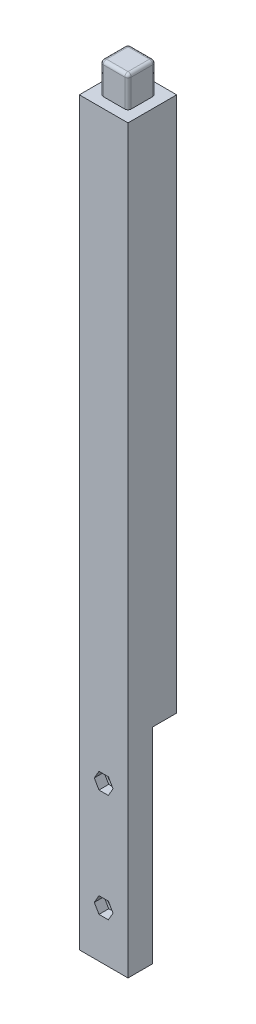
ISO-10303-21;
HEADER;
FILE_DESCRIPTION(('STEP AP214'),'2;1');
FILE_NAME('part.step','',(''),(''),'','','');
FILE_SCHEMA(('AUTOMOTIVE_DESIGN { 1 0 10303 214 1 1 1 1 }'));
ENDSEC;
DATA;
#1=APPLICATION_CONTEXT('core data for automotive mechanical design processes');
#2=APPLICATION_PROTOCOL_DEFINITION('international standard','automotive_design',2000,#1);
#3=PRODUCT_CONTEXT('',#1,'mechanical');
#4=PRODUCT('Part','Part','',(#3));
#5=PRODUCT_RELATED_PRODUCT_CATEGORY('part','',(#4));
#6=PRODUCT_DEFINITION_FORMATION('','',#4);
#7=PRODUCT_DEFINITION_CONTEXT('part definition',#1,'design');
#8=PRODUCT_DEFINITION('design','',#6,#7);
#9=PRODUCT_DEFINITION_SHAPE('','',#8);
#10=(LENGTH_UNIT() NAMED_UNIT(*) SI_UNIT(.MILLI.,.METRE.));
#11=(NAMED_UNIT(*) PLANE_ANGLE_UNIT() SI_UNIT($,.RADIAN.));
#12=(NAMED_UNIT(*) SI_UNIT($,.STERADIAN.) SOLID_ANGLE_UNIT());
#13=UNCERTAINTY_MEASURE_WITH_UNIT(LENGTH_MEASURE(1.E-05),#10,'distance_accuracy_value','');
#14=(GEOMETRIC_REPRESENTATION_CONTEXT(3) GLOBAL_UNCERTAINTY_ASSIGNED_CONTEXT((#13)) GLOBAL_UNIT_ASSIGNED_CONTEXT((#10,
#11,#12)) REPRESENTATION_CONTEXT('',''));
#15=CARTESIAN_POINT('',(0.,0.,0.));
#16=DIRECTION('',(0.,0.,1.));
#17=DIRECTION('',(1.,0.,0.));
#18=AXIS2_PLACEMENT_3D('',#15,#16,#17);
#19=CARTESIAN_POINT('',(352.5,-128.191488077077,42.3497474683057));
#20=DIRECTION('',(0.,0.,-1.));
#21=DIRECTION('',(-1.,0.,0.));
#22=AXIS2_PLACEMENT_3D('',#19,#20,#21);
#23=CYLINDRICAL_SURFACE('',#22,1.74999999999998);
#24=CARTESIAN_POINT('',(352.5,-128.191488077077,-99.9));
#25=DIRECTION('',(0.,0.,-1.));
#26=DIRECTION('',(-1.,0.,0.));
#27=AXIS2_PLACEMENT_3D('',#24,#25,#26);
#28=CIRCLE('',#27,1.74999999999998);
#29=CARTESIAN_POINT('',(350.75,-128.191488077077,-99.9));
#30=VERTEX_POINT('',#29);
#31=EDGE_CURVE('E363',#30,#30,#28,.T.);
#32=ORIENTED_EDGE('',*,*,#31,.T.);
#33=EDGE_LOOP('',(#32));
#34=FACE_BOUND('',#33,.T.);
#35=CARTESIAN_POINT('',(352.5,-128.191488077077,-95.4));
#36=DIRECTION('',(0.,0.,1.));
#37=DIRECTION('',(1.,0.,0.));
#38=AXIS2_PLACEMENT_3D('',#35,#36,#37);
#39=CIRCLE('',#38,1.74999999999998);
#40=CARTESIAN_POINT('',(354.25,-128.191488077077,-95.4));
#41=VERTEX_POINT('',#40);
#42=EDGE_CURVE('E41',#41,#41,#39,.F.);
#43=ORIENTED_EDGE('',*,*,#42,.F.);
#44=EDGE_LOOP('',(#43));
#45=FACE_BOUND('',#44,.T.);
#46=ADVANCED_FACE('F37',(#34,#45),#23,.F.);
#47=CARTESIAN_POINT('',(352.5,-95.0000000000001,42.3497474683057));
#48=DIRECTION('',(0.,0.,-1.));
#49=DIRECTION('',(-1.,0.,0.));
#50=AXIS2_PLACEMENT_3D('',#47,#48,#49);
#51=CYLINDRICAL_SURFACE('',#50,1.74999999999998);
#52=CARTESIAN_POINT('',(352.5,-95.0000000000001,-99.9));
#53=DIRECTION('',(0.,0.,-1.));
#54=DIRECTION('',(-1.,0.,0.));
#55=AXIS2_PLACEMENT_3D('',#52,#53,#54);
#56=CIRCLE('',#55,1.74999999999998);
#57=CARTESIAN_POINT('',(350.75,-95.0000000000001,-99.9));
#58=VERTEX_POINT('',#57);
#59=EDGE_CURVE('E367',#58,#58,#56,.T.);
#60=ORIENTED_EDGE('',*,*,#59,.T.);
#61=EDGE_LOOP('',(#60));
#62=FACE_BOUND('',#61,.T.);
#63=CARTESIAN_POINT('',(352.5,-95.0000000000001,-95.4));
#64=DIRECTION('',(0.,0.,1.));
#65=DIRECTION('',(1.,0.,0.));
#66=AXIS2_PLACEMENT_3D('',#63,#64,#65);
#67=CIRCLE('',#66,1.74999999999998);
#68=CARTESIAN_POINT('',(354.25,-95.0000000000001,-95.4));
#69=VERTEX_POINT('',#68);
#70=EDGE_CURVE('E288',#69,#69,#67,.F.);
#71=ORIENTED_EDGE('',*,*,#70,.F.);
#72=EDGE_LOOP('',(#71));
#73=FACE_BOUND('',#72,.T.);
#74=ADVANCED_FACE('F566',(#62,#73),#51,.F.);
#75=CARTESIAN_POINT('',(360.01,-143.191488077077,-99.9));
#76=DIRECTION('',(0.,-1.,0.));
#77=DIRECTION('',(0.,0.,-1.));
#78=AXIS2_PLACEMENT_3D('',#75,#76,#77);
#79=PLANE('',#78);
#80=DIRECTION('',(0.,0.,-1.));
#81=VECTOR('',#80,1.);
#82=CARTESIAN_POINT('',(360.,-143.191488077077,-107.4));
#83=LINE('',#82,#81);
#84=CARTESIAN_POINT('',(360.,-143.191488077077,-92.4));
#85=VERTEX_POINT('',#84);
#86=CARTESIAN_POINT('',(360.,-143.191488077077,-99.9));
#87=VERTEX_POINT('',#86);
#88=EDGE_CURVE('E531',#85,#87,#83,.T.);
#89=ORIENTED_EDGE('',*,*,#88,.F.);
#90=DIRECTION('',(1.,0.,0.));
#91=VECTOR('',#90,1.);
#92=CARTESIAN_POINT('',(345.,-143.191488077077,-92.4));
#93=LINE('',#92,#91);
#94=CARTESIAN_POINT('',(345.,-143.191488077077,-92.4));
#95=VERTEX_POINT('',#94);
#96=EDGE_CURVE('E371',#95,#85,#93,.T.);
#97=ORIENTED_EDGE('',*,*,#96,.F.);
#98=DIRECTION('',(0.,0.,1.));
#99=VECTOR('',#98,1.);
#100=CARTESIAN_POINT('',(345.,-143.191488077077,-107.4));
#101=LINE('',#100,#99);
#102=CARTESIAN_POINT('',(345.,-143.191488077077,-99.9));
#103=VERTEX_POINT('',#102);
#104=EDGE_CURVE('E407',#103,#95,#101,.T.);
#105=ORIENTED_EDGE('',*,*,#104,.F.);
#106=DIRECTION('',(-1.,0.,0.));
#107=VECTOR('',#106,1.);
#108=CARTESIAN_POINT('',(360.01,-143.191488077077,-99.9));
#109=LINE('',#108,#107);
#110=EDGE_CURVE('E11',#87,#103,#109,.T.);
#111=ORIENTED_EDGE('',*,*,#110,.F.);
#112=EDGE_LOOP('',(#89,#97,#105,#111));
#113=FACE_BOUND('',#112,.T.);
#114=ADVANCED_FACE('F572',(#113),#79,.T.);
#115=CARTESIAN_POINT('',(360.01,-80.,-99.9));
#116=DIRECTION('',(0.,0.,-1.));
#117=DIRECTION('',(-1.,0.,0.));
#118=AXIS2_PLACEMENT_3D('',#115,#116,#117);
#119=PLANE('',#118);
#120=ORIENTED_EDGE('',*,*,#59,.F.);
#121=EDGE_LOOP('',(#120));
#122=FACE_BOUND('',#121,.T.);
#123=ORIENTED_EDGE('',*,*,#31,.F.);
#124=EDGE_LOOP('',(#123));
#125=FACE_BOUND('',#124,.T.);
#126=DIRECTION('',(0.,1.,0.));
#127=VECTOR('',#126,1.);
#128=CARTESIAN_POINT('',(360.,-349.404691512674,-99.9));
#129=LINE('',#128,#127);
#130=CARTESIAN_POINT('',(360.,-80.,-99.9));
#131=VERTEX_POINT('',#130);
#132=EDGE_CURVE('E535',#87,#131,#129,.T.);
#133=ORIENTED_EDGE('',*,*,#132,.F.);
#134=ORIENTED_EDGE('',*,*,#110,.T.);
#135=DIRECTION('',(0.,-1.,0.));
#136=VECTOR('',#135,1.);
#137=CARTESIAN_POINT('',(345.,-349.404691512674,-99.9));
#138=LINE('',#137,#136);
#139=CARTESIAN_POINT('',(345.,-80.,-99.9));
#140=VERTEX_POINT('',#139);
#141=EDGE_CURVE('E519',#140,#103,#138,.T.);
#142=ORIENTED_EDGE('',*,*,#141,.F.);
#143=DIRECTION('',(-1.,0.,0.));
#144=VECTOR('',#143,1.);
#145=CARTESIAN_POINT('',(360.01,-80.,-99.9));
#146=LINE('',#145,#144);
#147=EDGE_CURVE('E47',#131,#140,#146,.T.);
#148=ORIENTED_EDGE('',*,*,#147,.F.);
#149=EDGE_LOOP('',(#133,#134,#142,#148));
#150=FACE_BOUND('',#149,.T.);
#151=ADVANCED_FACE('F652',(#122,#125,#150),#119,.T.);
#152=CARTESIAN_POINT('',(360.01,-80.,-107.4));
#153=DIRECTION('',(0.,-1.,0.));
#154=DIRECTION('',(0.,0.,-1.));
#155=AXIS2_PLACEMENT_3D('',#152,#153,#154);
#156=PLANE('',#155);
#157=DIRECTION('',(0.,0.,-1.));
#158=VECTOR('',#157,1.);
#159=CARTESIAN_POINT('',(360.,-80.,-107.4));
#160=LINE('',#159,#158);
#161=CARTESIAN_POINT('',(360.,-80.0000000000001,-107.4));
#162=VERTEX_POINT('',#161);
#163=EDGE_CURVE('E539',#131,#162,#160,.T.);
#164=ORIENTED_EDGE('',*,*,#163,.F.);
#165=ORIENTED_EDGE('',*,*,#147,.T.);
#166=DIRECTION('',(0.,0.,1.));
#167=VECTOR('',#166,1.);
#168=CARTESIAN_POINT('',(345.,-80.,-107.4));
#169=LINE('',#168,#167);
#170=CARTESIAN_POINT('',(345.,-80.0000000000001,-107.4));
#171=VERTEX_POINT('',#170);
#172=EDGE_CURVE('E523',#171,#140,#169,.T.);
#173=ORIENTED_EDGE('',*,*,#172,.F.);
#174=DIRECTION('',(-1.,0.,0.));
#175=VECTOR('',#174,1.);
#176=CARTESIAN_POINT('',(345.,-80.,-107.4));
#177=LINE('',#176,#175);
#178=EDGE_CURVE('E527',#162,#171,#177,.T.);
#179=ORIENTED_EDGE('',*,*,#178,.F.);
#180=EDGE_LOOP('',(#164,#165,#173,#179));
#181=FACE_BOUND('',#180,.T.);
#182=ADVANCED_FACE('F650',(#181),#156,.T.);
#183=CARTESIAN_POINT('',(349.2,94.5,-96.6));
#184=DIRECTION('',(0.,-1.,0.));
#185=DIRECTION('',(0.,0.,-1.));
#186=AXIS2_PLACEMENT_3D('',#183,#184,#185);
#187=PLANE('',#186);
#188=DIRECTION('',(-1.,0.,0.));
#189=VECTOR('',#188,1.);
#190=CARTESIAN_POINT('',(349.2,94.5,-103.2));
#191=LINE('',#190,#189);
#192=CARTESIAN_POINT('',(355.8,94.5,-103.2));
#193=VERTEX_POINT('',#192);
#194=CARTESIAN_POINT('',(349.2,94.5,-103.2));
#195=VERTEX_POINT('',#194);
#196=EDGE_CURVE('E429',#193,#195,#191,.T.);
#197=ORIENTED_EDGE('',*,*,#196,.T.);
#198=DIRECTION('',(0.,0.,1.));
#199=VECTOR('',#198,1.);
#200=CARTESIAN_POINT('',(349.2,94.5,-96.6));
#201=LINE('',#200,#199);
#202=CARTESIAN_POINT('',(349.2,94.5,-96.6));
#203=VERTEX_POINT('',#202);
#204=EDGE_CURVE('E425',#195,#203,#201,.T.);
#205=ORIENTED_EDGE('',*,*,#204,.T.);
#206=DIRECTION('',(1.,0.,0.));
#207=VECTOR('',#206,1.);
#208=CARTESIAN_POINT('',(349.2,94.5,-96.6));
#209=LINE('',#208,#207);
#210=CARTESIAN_POINT('',(355.8,94.5,-96.6));
#211=VERTEX_POINT('',#210);
#212=EDGE_CURVE('E435',#203,#211,#209,.T.);
#213=ORIENTED_EDGE('',*,*,#212,.T.);
#214=DIRECTION('',(0.,0.,-1.));
#215=VECTOR('',#214,1.);
#216=CARTESIAN_POINT('',(355.8,94.5,-96.6));
#217=LINE('',#216,#215);
#218=EDGE_CURVE('E432',#211,#193,#217,.T.);
#219=ORIENTED_EDGE('',*,*,#218,.T.);
#220=EDGE_LOOP('',(#197,#205,#213,#219));
#221=FACE_BOUND('',#220,.T.);
#222=ADVANCED_FACE('F575',(#221),#187,.F.);
#223=CARTESIAN_POINT('',(349.2,93.5,-96.6));
#224=DIRECTION('',(1.,0.,0.));
#225=DIRECTION('',(0.,0.,-1.));
#226=AXIS2_PLACEMENT_3D('',#223,#224,#225);
#227=CYLINDRICAL_SURFACE('',#226,1.);
#228=CARTESIAN_POINT('',(355.8,93.5,-96.6));
#229=DIRECTION('',(-1.,0.,0.));
#230=DIRECTION('',(0.,0.,1.));
#231=AXIS2_PLACEMENT_3D('',#228,#229,#230);
#232=CIRCLE('',#231,1.);
#233=CARTESIAN_POINT('',(355.8,93.5,-95.6));
#234=VERTEX_POINT('',#233);
#235=EDGE_CURVE('E393',#234,#211,#232,.T.);
#236=ORIENTED_EDGE('',*,*,#235,.T.);
#237=ORIENTED_EDGE('',*,*,#212,.F.);
#238=CARTESIAN_POINT('',(349.2,93.5,-96.6));
#239=DIRECTION('',(-1.,0.,0.));
#240=DIRECTION('',(0.,0.,1.));
#241=AXIS2_PLACEMENT_3D('',#238,#239,#240);
#242=CIRCLE('',#241,1.);
#243=CARTESIAN_POINT('',(349.2,93.5,-95.6));
#244=VERTEX_POINT('',#243);
#245=EDGE_CURVE('E400',#244,#203,#242,.T.);
#246=ORIENTED_EDGE('',*,*,#245,.F.);
#247=DIRECTION('',(1.,0.,0.));
#248=VECTOR('',#247,1.);
#249=CARTESIAN_POINT('',(349.2,93.5,-95.6));
#250=LINE('',#249,#248);
#251=EDGE_CURVE('E403',#234,#244,#250,.F.);
#252=ORIENTED_EDGE('',*,*,#251,.F.);
#253=EDGE_LOOP('',(#236,#237,#246,#252));
#254=FACE_BOUND('',#253,.T.);
#255=ADVANCED_FACE('F598',(#254),#227,.T.);
#256=CARTESIAN_POINT('',(355.8,93.5,-96.6));
#257=DIRECTION('',(0.,-1.,0.));
#258=DIRECTION('',(0.,0.,-1.));
#259=AXIS2_PLACEMENT_3D('',#256,#257,#258);
#260=SPHERICAL_SURFACE('',#259,1.);
#261=CARTESIAN_POINT('',(355.8,93.5,-96.6));
#262=DIRECTION('',(0.,-1.,0.));
#263=DIRECTION('',(0.,0.,-1.));
#264=AXIS2_PLACEMENT_3D('',#261,#262,#263);
#265=CIRCLE('',#264,1.);
#266=CARTESIAN_POINT('',(356.8,93.5,-96.6));
#267=VERTEX_POINT('',#266);
#268=EDGE_CURVE('E406',#267,#234,#265,.T.);
#269=ORIENTED_EDGE('',*,*,#268,.F.);
#270=CARTESIAN_POINT('',(355.8,93.5,-96.6));
#271=DIRECTION('',(0.,0.,1.));
#272=DIRECTION('',(1.,0.,0.));
#273=AXIS2_PLACEMENT_3D('',#270,#271,#272);
#274=CIRCLE('',#273,1.);
#275=EDGE_CURVE('E385',#267,#211,#274,.T.);
#276=ORIENTED_EDGE('',*,*,#275,.T.);
#277=ORIENTED_EDGE('',*,*,#235,.F.);
#278=EDGE_LOOP('',(#269,#276,#277));
#279=FACE_BOUND('',#278,.T.);
#280=ADVANCED_FACE('F590',(#279),#260,.T.);
#281=CARTESIAN_POINT('',(355.8,93.5,-96.6));
#282=DIRECTION('',(0.,0.,-1.));
#283=DIRECTION('',(-1.,0.,0.));
#284=AXIS2_PLACEMENT_3D('',#281,#282,#283);
#285=CYLINDRICAL_SURFACE('',#284,1.);
#286=CARTESIAN_POINT('',(355.8,93.5,-103.2));
#287=DIRECTION('',(0.,0.,1.));
#288=DIRECTION('',(1.,0.,0.));
#289=AXIS2_PLACEMENT_3D('',#286,#287,#288);
#290=CIRCLE('',#289,1.);
#291=CARTESIAN_POINT('',(356.8,93.5,-103.2));
#292=VERTEX_POINT('',#291);
#293=EDGE_CURVE('E376',#292,#193,#290,.T.);
#294=ORIENTED_EDGE('',*,*,#293,.T.);
#295=ORIENTED_EDGE('',*,*,#218,.F.);
#296=ORIENTED_EDGE('',*,*,#275,.F.);
#297=DIRECTION('',(0.,0.,-1.));
#298=VECTOR('',#297,1.);
#299=CARTESIAN_POINT('',(356.8,93.5,-96.6));
#300=LINE('',#299,#298);
#301=EDGE_CURVE('E410',#292,#267,#300,.F.);
#302=ORIENTED_EDGE('',*,*,#301,.F.);
#303=EDGE_LOOP('',(#294,#295,#296,#302));
#304=FACE_BOUND('',#303,.T.);
#305=ADVANCED_FACE('F582',(#304),#285,.T.);
#306=CARTESIAN_POINT('',(355.8,93.5,-103.2));
#307=DIRECTION('',(0.,-1.,0.));
#308=DIRECTION('',(0.,0.,-1.));
#309=AXIS2_PLACEMENT_3D('',#306,#307,#308);
#310=SPHERICAL_SURFACE('',#309,1.);
#311=ORIENTED_EDGE('',*,*,#293,.F.);
#312=CARTESIAN_POINT('',(355.8,93.5,-103.2));
#313=DIRECTION('',(0.,-1.,0.));
#314=DIRECTION('',(0.,0.,-1.));
#315=AXIS2_PLACEMENT_3D('',#312,#313,#314);
#316=CIRCLE('',#315,1.);
#317=CARTESIAN_POINT('',(355.8,93.5,-104.2));
#318=VERTEX_POINT('',#317);
#319=EDGE_CURVE('E413',#318,#292,#316,.T.);
#320=ORIENTED_EDGE('',*,*,#319,.F.);
#321=CARTESIAN_POINT('',(355.8,93.5,-103.2));
#322=DIRECTION('',(-1.,0.,0.));
#323=DIRECTION('',(0.,0.,1.));
#324=AXIS2_PLACEMENT_3D('',#321,#322,#323);
#325=CIRCLE('',#324,1.);
#326=EDGE_CURVE('E372',#193,#318,#325,.T.);
#327=ORIENTED_EDGE('',*,*,#326,.F.);
#328=EDGE_LOOP('',(#311,#320,#327));
#329=FACE_BOUND('',#328,.T.);
#330=ADVANCED_FACE('F578',(#329),#310,.T.);
#331=CARTESIAN_POINT('',(349.2,93.5,-103.2));
#332=DIRECTION('',(-1.,0.,0.));
#333=DIRECTION('',(0.,0.,1.));
#334=AXIS2_PLACEMENT_3D('',#331,#332,#333);
#335=CYLINDRICAL_SURFACE('',#334,1.);
#336=ORIENTED_EDGE('',*,*,#326,.T.);
#337=DIRECTION('',(-1.,0.,0.));
#338=VECTOR('',#337,1.);
#339=CARTESIAN_POINT('',(355.8,93.5,-104.2));
#340=LINE('',#339,#338);
#341=CARTESIAN_POINT('',(349.2,93.5,-104.2));
#342=VERTEX_POINT('',#341);
#343=EDGE_CURVE('E416',#342,#318,#340,.F.);
#344=ORIENTED_EDGE('',*,*,#343,.F.);
#345=CARTESIAN_POINT('',(349.2,93.5,-103.2));
#346=DIRECTION('',(-1.,0.,0.));
#347=DIRECTION('',(0.,0.,1.));
#348=AXIS2_PLACEMENT_3D('',#345,#346,#347);
#349=CIRCLE('',#348,1.);
#350=EDGE_CURVE('E381',#195,#342,#349,.T.);
#351=ORIENTED_EDGE('',*,*,#350,.F.);
#352=ORIENTED_EDGE('',*,*,#196,.F.);
#353=EDGE_LOOP('',(#336,#344,#351,#352));
#354=FACE_BOUND('',#353,.T.);
#355=ADVANCED_FACE('F581',(#354),#335,.T.);
#356=CARTESIAN_POINT('',(349.2,93.5,-103.2));
#357=DIRECTION('',(0.,-1.,0.));
#358=DIRECTION('',(0.,0.,-1.));
#359=AXIS2_PLACEMENT_3D('',#356,#357,#358);
#360=SPHERICAL_SURFACE('',#359,1.);
#361=ORIENTED_EDGE('',*,*,#350,.T.);
#362=CARTESIAN_POINT('',(349.2,93.5,-103.2));
#363=DIRECTION('',(0.,-1.,0.));
#364=DIRECTION('',(0.,0.,-1.));
#365=AXIS2_PLACEMENT_3D('',#362,#363,#364);
#366=CIRCLE('',#365,1.);
#367=CARTESIAN_POINT('',(348.2,93.5,-103.2));
#368=VERTEX_POINT('',#367);
#369=EDGE_CURVE('E419',#368,#342,#366,.T.);
#370=ORIENTED_EDGE('',*,*,#369,.F.);
#371=CARTESIAN_POINT('',(349.2,93.5,-103.2));
#372=DIRECTION('',(0.,0.,1.));
#373=DIRECTION('',(1.,0.,0.));
#374=AXIS2_PLACEMENT_3D('',#371,#372,#373);
#375=CIRCLE('',#374,1.);
#376=EDGE_CURVE('E389',#195,#368,#375,.T.);
#377=ORIENTED_EDGE('',*,*,#376,.F.);
#378=EDGE_LOOP('',(#361,#370,#377));
#379=FACE_BOUND('',#378,.T.);
#380=ADVANCED_FACE('F586',(#379),#360,.T.);
#381=CARTESIAN_POINT('',(349.2,93.5,-96.6));
#382=DIRECTION('',(0.,0.,1.));
#383=DIRECTION('',(1.,0.,0.));
#384=AXIS2_PLACEMENT_3D('',#381,#382,#383);
#385=CYLINDRICAL_SURFACE('',#384,1.);
#386=ORIENTED_EDGE('',*,*,#376,.T.);
#387=DIRECTION('',(0.,0.,1.));
#388=VECTOR('',#387,1.);
#389=CARTESIAN_POINT('',(348.2,93.5,-103.2));
#390=LINE('',#389,#388);
#391=CARTESIAN_POINT('',(348.2,93.5,-96.6));
#392=VERTEX_POINT('',#391);
#393=EDGE_CURVE('E422',#392,#368,#390,.F.);
#394=ORIENTED_EDGE('',*,*,#393,.F.);
#395=CARTESIAN_POINT('',(349.2,93.5,-96.6));
#396=DIRECTION('',(0.,0.,1.));
#397=DIRECTION('',(1.,0.,0.));
#398=AXIS2_PLACEMENT_3D('',#395,#396,#397);
#399=CIRCLE('',#398,1.);
#400=EDGE_CURVE('E397',#203,#392,#399,.T.);
#401=ORIENTED_EDGE('',*,*,#400,.F.);
#402=ORIENTED_EDGE('',*,*,#204,.F.);
#403=EDGE_LOOP('',(#386,#394,#401,#402));
#404=FACE_BOUND('',#403,.T.);
#405=ADVANCED_FACE('F594',(#404),#385,.T.);
#406=CARTESIAN_POINT('',(349.2,93.5,-96.6));
#407=DIRECTION('',(0.,-1.,0.));
#408=DIRECTION('',(0.,0.,-1.));
#409=AXIS2_PLACEMENT_3D('',#406,#407,#408);
#410=SPHERICAL_SURFACE('',#409,1.);
#411=ORIENTED_EDGE('',*,*,#400,.T.);
#412=CARTESIAN_POINT('',(349.2,93.5,-96.6));
#413=DIRECTION('',(0.,-1.,0.));
#414=DIRECTION('',(0.,0.,-1.));
#415=AXIS2_PLACEMENT_3D('',#412,#413,#414);
#416=CIRCLE('',#415,1.);
#417=EDGE_CURVE('E438',#244,#392,#416,.T.);
#418=ORIENTED_EDGE('',*,*,#417,.F.);
#419=ORIENTED_EDGE('',*,*,#245,.T.);
#420=EDGE_LOOP('',(#411,#418,#419));
#421=FACE_BOUND('',#420,.T.);
#422=ADVANCED_FACE('F602',(#421),#410,.T.);
#423=CARTESIAN_POINT('',(349.2,94.5,-95.6));
#424=DIRECTION('',(0.,0.,-1.));
#425=DIRECTION('',(-1.,0.,0.));
#426=AXIS2_PLACEMENT_3D('',#423,#424,#425);
#427=PLANE('',#426);
#428=DIRECTION('',(0.,-1.,0.));
#429=VECTOR('',#428,1.);
#430=CARTESIAN_POINT('',(355.8,94.5,-95.6));
#431=LINE('',#430,#429);
#432=CARTESIAN_POINT('',(355.8,85.,-95.6));
#433=VERTEX_POINT('',#432);
#434=EDGE_CURVE('E462',#234,#433,#431,.T.);
#435=ORIENTED_EDGE('',*,*,#434,.F.);
#436=ORIENTED_EDGE('',*,*,#251,.T.);
#437=DIRECTION('',(0.,-1.,0.));
#438=VECTOR('',#437,1.);
#439=CARTESIAN_POINT('',(349.2,94.5,-95.6));
#440=LINE('',#439,#438);
#441=CARTESIAN_POINT('',(349.2,85.,-95.6));
#442=VERTEX_POINT('',#441);
#443=EDGE_CURVE('E459',#244,#442,#440,.T.);
#444=ORIENTED_EDGE('',*,*,#443,.T.);
#445=DIRECTION('',(1.,0.,0.));
#446=VECTOR('',#445,1.);
#447=CARTESIAN_POINT('',(349.2,85.,-95.6));
#448=LINE('',#447,#446);
#449=EDGE_CURVE('E508',#442,#433,#448,.T.);
#450=ORIENTED_EDGE('',*,*,#449,.T.);
#451=EDGE_LOOP('',(#435,#436,#444,#450));
#452=FACE_BOUND('',#451,.T.);
#453=ADVANCED_FACE('F609',(#452),#427,.F.);
#454=CARTESIAN_POINT('',(355.8,94.5,-96.6));
#455=DIRECTION('',(0.,-1.,0.));
#456=DIRECTION('',(0.,0.,-1.));
#457=AXIS2_PLACEMENT_3D('',#454,#455,#456);
#458=CYLINDRICAL_SURFACE('',#457,1.);
#459=DIRECTION('',(0.,-1.,0.));
#460=VECTOR('',#459,1.);
#461=CARTESIAN_POINT('',(356.8,94.5,-96.6));
#462=LINE('',#461,#460);
#463=CARTESIAN_POINT('',(356.8,85.,-96.6));
#464=VERTEX_POINT('',#463);
#465=EDGE_CURVE('E466',#267,#464,#462,.T.);
#466=ORIENTED_EDGE('',*,*,#465,.F.);
#467=ORIENTED_EDGE('',*,*,#268,.T.);
#468=ORIENTED_EDGE('',*,*,#434,.T.);
#469=CARTESIAN_POINT('',(355.8,85.,-96.6));
#470=DIRECTION('',(0.,1.,0.));
#471=DIRECTION('',(0.,0.,1.));
#472=AXIS2_PLACEMENT_3D('',#469,#470,#471);
#473=CIRCLE('',#472,1.);
#474=EDGE_CURVE('E504',#433,#464,#473,.T.);
#475=ORIENTED_EDGE('',*,*,#474,.T.);
#476=EDGE_LOOP('',(#466,#467,#468,#475));
#477=FACE_BOUND('',#476,.T.);
#478=ADVANCED_FACE('F624',(#477),#458,.T.);
#479=CARTESIAN_POINT('',(356.8,94.5,-96.6));
#480=DIRECTION('',(-1.,0.,0.));
#481=DIRECTION('',(0.,0.,1.));
#482=AXIS2_PLACEMENT_3D('',#479,#480,#481);
#483=PLANE('',#482);
#484=DIRECTION('',(0.,-1.,0.));
#485=VECTOR('',#484,1.);
#486=CARTESIAN_POINT('',(356.8,94.5,-103.2));
#487=LINE('',#486,#485);
#488=CARTESIAN_POINT('',(356.8,85.,-103.2));
#489=VERTEX_POINT('',#488);
#490=EDGE_CURVE('E469',#292,#489,#487,.T.);
#491=ORIENTED_EDGE('',*,*,#490,.F.);
#492=ORIENTED_EDGE('',*,*,#301,.T.);
#493=ORIENTED_EDGE('',*,*,#465,.T.);
#494=DIRECTION('',(0.,0.,-1.));
#495=VECTOR('',#494,1.);
#496=CARTESIAN_POINT('',(356.8,85.,-96.6));
#497=LINE('',#496,#495);
#498=EDGE_CURVE('E500',#464,#489,#497,.T.);
#499=ORIENTED_EDGE('',*,*,#498,.T.);
#500=EDGE_LOOP('',(#491,#492,#493,#499));
#501=FACE_BOUND('',#500,.T.);
#502=ADVANCED_FACE('F628',(#501),#483,.F.);
#503=CARTESIAN_POINT('',(355.8,94.5,-103.2));
#504=DIRECTION('',(0.,-1.,0.));
#505=DIRECTION('',(0.,0.,-1.));
#506=AXIS2_PLACEMENT_3D('',#503,#504,#505);
#507=CYLINDRICAL_SURFACE('',#506,1.);
#508=DIRECTION('',(0.,-1.,0.));
#509=VECTOR('',#508,1.);
#510=CARTESIAN_POINT('',(355.8,94.5,-104.2));
#511=LINE('',#510,#509);
#512=CARTESIAN_POINT('',(355.8,85.,-104.2));
#513=VERTEX_POINT('',#512);
#514=EDGE_CURVE('E472',#318,#513,#511,.T.);
#515=ORIENTED_EDGE('',*,*,#514,.F.);
#516=ORIENTED_EDGE('',*,*,#319,.T.);
#517=ORIENTED_EDGE('',*,*,#490,.T.);
#518=CARTESIAN_POINT('',(355.8,85.,-103.2));
#519=DIRECTION('',(0.,1.,0.));
#520=DIRECTION('',(0.,0.,1.));
#521=AXIS2_PLACEMENT_3D('',#518,#519,#520);
#522=CIRCLE('',#521,1.);
#523=EDGE_CURVE('E496',#489,#513,#522,.T.);
#524=ORIENTED_EDGE('',*,*,#523,.T.);
#525=EDGE_LOOP('',(#515,#516,#517,#524));
#526=FACE_BOUND('',#525,.T.);
#527=ADVANCED_FACE('F632',(#526),#507,.T.);
#528=CARTESIAN_POINT('',(355.8,94.5,-104.2));
#529=DIRECTION('',(0.,0.,1.));
#530=DIRECTION('',(1.,0.,0.));
#531=AXIS2_PLACEMENT_3D('',#528,#529,#530);
#532=PLANE('',#531);
#533=DIRECTION('',(0.,-1.,0.));
#534=VECTOR('',#533,1.);
#535=CARTESIAN_POINT('',(349.2,94.5,-104.2));
#536=LINE('',#535,#534);
#537=CARTESIAN_POINT('',(349.2,85.,-104.2));
#538=VERTEX_POINT('',#537);
#539=EDGE_CURVE('E475',#342,#538,#536,.T.);
#540=ORIENTED_EDGE('',*,*,#539,.F.);
#541=ORIENTED_EDGE('',*,*,#343,.T.);
#542=ORIENTED_EDGE('',*,*,#514,.T.);
#543=DIRECTION('',(-1.,0.,0.));
#544=VECTOR('',#543,1.);
#545=CARTESIAN_POINT('',(355.8,85.,-104.2));
#546=LINE('',#545,#544);
#547=EDGE_CURVE('E492',#513,#538,#546,.T.);
#548=ORIENTED_EDGE('',*,*,#547,.T.);
#549=EDGE_LOOP('',(#540,#541,#542,#548));
#550=FACE_BOUND('',#549,.T.);
#551=ADVANCED_FACE('F636',(#550),#532,.F.);
#552=CARTESIAN_POINT('',(349.2,94.5,-103.2));
#553=DIRECTION('',(0.,-1.,0.));
#554=DIRECTION('',(0.,0.,-1.));
#555=AXIS2_PLACEMENT_3D('',#552,#553,#554);
#556=CYLINDRICAL_SURFACE('',#555,1.);
#557=DIRECTION('',(0.,-1.,0.));
#558=VECTOR('',#557,1.);
#559=CARTESIAN_POINT('',(348.2,94.5,-103.2));
#560=LINE('',#559,#558);
#561=CARTESIAN_POINT('',(348.2,85.,-103.2));
#562=VERTEX_POINT('',#561);
#563=EDGE_CURVE('E478',#368,#562,#560,.T.);
#564=ORIENTED_EDGE('',*,*,#563,.F.);
#565=ORIENTED_EDGE('',*,*,#369,.T.);
#566=ORIENTED_EDGE('',*,*,#539,.T.);
#567=CARTESIAN_POINT('',(349.2,85.,-103.2));
#568=DIRECTION('',(0.,1.,0.));
#569=DIRECTION('',(0.,0.,1.));
#570=AXIS2_PLACEMENT_3D('',#567,#568,#569);
#571=CIRCLE('',#570,1.);
#572=EDGE_CURVE('E488',#538,#562,#571,.T.);
#573=ORIENTED_EDGE('',*,*,#572,.T.);
#574=EDGE_LOOP('',(#564,#565,#566,#573));
#575=FACE_BOUND('',#574,.T.);
#576=ADVANCED_FACE('F640',(#575),#556,.T.);
#577=CARTESIAN_POINT('',(348.2,94.5,-103.2));
#578=DIRECTION('',(1.,0.,0.));
#579=DIRECTION('',(0.,0.,-1.));
#580=AXIS2_PLACEMENT_3D('',#577,#578,#579);
#581=PLANE('',#580);
#582=DIRECTION('',(0.,-1.,0.));
#583=VECTOR('',#582,1.);
#584=CARTESIAN_POINT('',(348.2,94.5,-96.6));
#585=LINE('',#584,#583);
#586=CARTESIAN_POINT('',(348.2,85.,-96.6));
#587=VERTEX_POINT('',#586);
#588=EDGE_CURVE('E481',#392,#587,#585,.T.);
#589=ORIENTED_EDGE('',*,*,#588,.F.);
#590=ORIENTED_EDGE('',*,*,#393,.T.);
#591=ORIENTED_EDGE('',*,*,#563,.T.);
#592=DIRECTION('',(0.,0.,1.));
#593=VECTOR('',#592,1.);
#594=CARTESIAN_POINT('',(348.2,85.,-103.2));
#595=LINE('',#594,#593);
#596=EDGE_CURVE('E484',#562,#587,#595,.T.);
#597=ORIENTED_EDGE('',*,*,#596,.T.);
#598=EDGE_LOOP('',(#589,#590,#591,#597));
#599=FACE_BOUND('',#598,.T.);
#600=ADVANCED_FACE('F620',(#599),#581,.F.);
#601=CARTESIAN_POINT('',(349.2,94.5,-96.6));
#602=DIRECTION('',(0.,-1.,0.));
#603=DIRECTION('',(0.,0.,-1.));
#604=AXIS2_PLACEMENT_3D('',#601,#602,#603);
#605=CYLINDRICAL_SURFACE('',#604,1.);
#606=ORIENTED_EDGE('',*,*,#443,.F.);
#607=ORIENTED_EDGE('',*,*,#417,.T.);
#608=ORIENTED_EDGE('',*,*,#588,.T.);
#609=CARTESIAN_POINT('',(349.2,85.,-96.6));
#610=DIRECTION('',(0.,1.,0.));
#611=DIRECTION('',(0.,0.,-1.));
#612=AXIS2_PLACEMENT_3D('',#609,#610,#611);
#613=CIRCLE('',#612,1.);
#614=EDGE_CURVE('E377',#587,#442,#613,.T.);
#615=ORIENTED_EDGE('',*,*,#614,.T.);
#616=EDGE_LOOP('',(#606,#607,#608,#615));
#617=FACE_BOUND('',#616,.T.);
#618=ADVANCED_FACE('F617',(#617),#605,.T.);
#619=CARTESIAN_POINT('',(360.,-349.404691512674,-107.4));
#620=DIRECTION('',(1.,0.,0.));
#621=DIRECTION('',(0.,0.,-1.));
#622=AXIS2_PLACEMENT_3D('',#619,#620,#621);
#623=PLANE('',#622);
#624=ORIENTED_EDGE('',*,*,#132,.T.);
#625=ORIENTED_EDGE('',*,*,#163,.T.);
#626=DIRECTION('',(0.,1.,0.));
#627=VECTOR('',#626,1.);
#628=CARTESIAN_POINT('',(360.,-349.404691512674,-107.4));
#629=LINE('',#628,#627);
#630=CARTESIAN_POINT('',(360.,85.,-107.4));
#631=VERTEX_POINT('',#630);
#632=EDGE_CURVE('E548',#162,#631,#629,.T.);
#633=ORIENTED_EDGE('',*,*,#632,.T.);
#634=DIRECTION('',(0.,0.,1.));
#635=VECTOR('',#634,1.);
#636=CARTESIAN_POINT('',(360.,85.,-107.4));
#637=LINE('',#636,#635);
#638=CARTESIAN_POINT('',(360.,85.,-92.4));
#639=VERTEX_POINT('',#638);
#640=EDGE_CURVE('E443',#631,#639,#637,.T.);
#641=ORIENTED_EDGE('',*,*,#640,.T.);
#642=DIRECTION('',(0.,1.,0.));
#643=VECTOR('',#642,1.);
#644=CARTESIAN_POINT('',(360.,-349.404691512674,-92.4));
#645=LINE('',#644,#643);
#646=EDGE_CURVE('E455',#85,#639,#645,.T.);
#647=ORIENTED_EDGE('',*,*,#646,.F.);
#648=ORIENTED_EDGE('',*,*,#88,.T.);
#649=EDGE_LOOP('',(#624,#625,#633,#641,#647,#648));
#650=FACE_BOUND('',#649,.T.);
#651=ADVANCED_FACE('F615',(#650),#623,.T.);
#652=CARTESIAN_POINT('',(150.,85.,0.));
#653=DIRECTION('',(0.,-1.,0.));
#654=DIRECTION('',(0.,0.,-1.));
#655=AXIS2_PLACEMENT_3D('',#652,#653,#654);
#656=PLANE('',#655);
#657=DIRECTION('',(-1.,0.,0.));
#658=VECTOR('',#657,1.);
#659=CARTESIAN_POINT('',(345.,85.,-92.4));
#660=LINE('',#659,#658);
#661=CARTESIAN_POINT('',(345.,85.,-92.4));
#662=VERTEX_POINT('',#661);
#663=EDGE_CURVE('E447',#639,#662,#660,.T.);
#664=ORIENTED_EDGE('',*,*,#663,.F.);
#665=ORIENTED_EDGE('',*,*,#640,.F.);
#666=DIRECTION('',(1.,0.,0.));
#667=VECTOR('',#666,1.);
#668=CARTESIAN_POINT('',(345.,85.,-107.4));
#669=LINE('',#668,#667);
#670=CARTESIAN_POINT('',(345.,85.,-107.4));
#671=VERTEX_POINT('',#670);
#672=EDGE_CURVE('E442',#671,#631,#669,.T.);
#673=ORIENTED_EDGE('',*,*,#672,.F.);
#674=DIRECTION('',(0.,0.,-1.));
#675=VECTOR('',#674,1.);
#676=CARTESIAN_POINT('',(345.,85.,-107.4));
#677=LINE('',#676,#675);
#678=EDGE_CURVE('E451',#662,#671,#677,.T.);
#679=ORIENTED_EDGE('',*,*,#678,.F.);
#680=EDGE_LOOP('',(#664,#665,#673,#679));
#681=FACE_BOUND('',#680,.T.);
#682=ORIENTED_EDGE('',*,*,#614,.F.);
#683=ORIENTED_EDGE('',*,*,#596,.F.);
#684=ORIENTED_EDGE('',*,*,#572,.F.);
#685=ORIENTED_EDGE('',*,*,#547,.F.);
#686=ORIENTED_EDGE('',*,*,#523,.F.);
#687=ORIENTED_EDGE('',*,*,#498,.F.);
#688=ORIENTED_EDGE('',*,*,#474,.F.);
#689=ORIENTED_EDGE('',*,*,#449,.F.);
#690=EDGE_LOOP('',(#682,#683,#684,#685,#686,#687,#688,#689));
#691=FACE_BOUND('',#690,.T.);
#692=ADVANCED_FACE('F611',(#681,#691),#656,.F.);
#693=CARTESIAN_POINT('',(345.,-349.404691512674,-92.4));
#694=DIRECTION('',(0.,0.,1.));
#695=DIRECTION('',(1.,0.,0.));
#696=AXIS2_PLACEMENT_3D('',#693,#694,#695);
#697=PLANE('',#696);
#698=DIRECTION('',(-1.,0.,0.));
#699=VECTOR('',#698,1.);
#700=CARTESIAN_POINT('',(345.,-125.691488077077,-92.4));
#701=LINE('',#700,#699);
#702=CARTESIAN_POINT('',(353.943375672974,-125.691488077077,-92.4));
#703=VERTEX_POINT('',#702);
#704=CARTESIAN_POINT('',(351.056624327026,-125.691488077077,-92.4));
#705=VERTEX_POINT('',#704);
#706=EDGE_CURVE('E55',#703,#705,#701,.T.);
#707=ORIENTED_EDGE('',*,*,#706,.F.);
#708=DIRECTION('',(-0.499999999999992,0.866025403784443,0.));
#709=VECTOR('',#708,1.);
#710=CARTESIAN_POINT('',(448.578190423341,-289.603795389585,-92.4));
#711=LINE('',#710,#709);
#712=CARTESIAN_POINT('',(355.386751345948,-128.191488077077,-92.4));
#713=VERTEX_POINT('',#712);
#714=EDGE_CURVE('E249',#713,#703,#711,.T.);
#715=ORIENTED_EDGE('',*,*,#714,.F.);
#716=DIRECTION('',(0.500000000000006,0.866025403784435,0.));
#717=VECTOR('',#716,1.);
#718=CARTESIAN_POINT('',(257.001936595579,-298.598985917965,-92.4));
#719=LINE('',#718,#717);
#720=CARTESIAN_POINT('',(353.943375672974,-130.691488077077,-92.4));
#721=VERTEX_POINT('',#720);
#722=EDGE_CURVE('E254',#721,#713,#719,.T.);
#723=ORIENTED_EDGE('',*,*,#722,.F.);
#724=DIRECTION('',(1.,0.,0.));
#725=VECTOR('',#724,1.);
#726=CARTESIAN_POINT('',(345.,-130.691488077077,-92.4));
#727=LINE('',#726,#725);
#728=CARTESIAN_POINT('',(351.056624327026,-130.691488077077,-92.4));
#729=VERTEX_POINT('',#728);
#730=EDGE_CURVE('E278',#729,#721,#727,.T.);
#731=ORIENTED_EDGE('',*,*,#730,.F.);
#732=DIRECTION('',(0.499999999999992,-0.866025403784443,0.));
#733=VECTOR('',#732,1.);
#734=CARTESIAN_POINT('',(444.248063404419,-292.103795389585,-92.4));
#735=LINE('',#734,#733);
#736=CARTESIAN_POINT('',(349.613248654052,-128.191488077077,-92.4));
#737=VERTEX_POINT('',#736);
#738=EDGE_CURVE('E274',#737,#729,#735,.T.);
#739=ORIENTED_EDGE('',*,*,#738,.F.);
#740=DIRECTION('',(-0.500000000000006,-0.866025403784435,0.));
#741=VECTOR('',#740,1.);
#742=CARTESIAN_POINT('',(252.671809576657,-296.098985917965,-92.4));
#743=LINE('',#742,#741);
#744=EDGE_CURVE('E270',#705,#737,#743,.T.);
#745=ORIENTED_EDGE('',*,*,#744,.F.);
#746=EDGE_LOOP('',(#707,#715,#723,#731,#739,#745));
#747=FACE_BOUND('',#746,.T.);
#748=DIRECTION('',(-0.499999999999992,0.866025403784443,0.));
#749=VECTOR('',#748,1.);
#750=CARTESIAN_POINT('',(462.950526355419,-281.305923370316,-92.4));
#751=LINE('',#750,#749);
#752=CARTESIAN_POINT('',(355.386751345948,-95.0000000000001,-92.4));
#753=VERTEX_POINT('',#752);
#754=CARTESIAN_POINT('',(353.943375672974,-92.5000000000001,-92.4));
#755=VERTEX_POINT('',#754);
#756=EDGE_CURVE('E63',#753,#755,#751,.T.);
#757=ORIENTED_EDGE('',*,*,#756,.F.);
#758=DIRECTION('',(0.500000000000008,0.866025403784434,0.));
#759=VECTOR('',#758,1.);
#760=CARTESIAN_POINT('',(242.6296006635,-290.301113898695,-92.4));
#761=LINE('',#760,#759);
#762=CARTESIAN_POINT('',(353.943375672974,-97.5000000000001,-92.4));
#763=VERTEX_POINT('',#762);
#764=EDGE_CURVE('E305',#763,#753,#761,.T.);
#765=ORIENTED_EDGE('',*,*,#764,.F.);
#766=DIRECTION('',(1.,0.,0.));
#767=VECTOR('',#766,1.);
#768=CARTESIAN_POINT('',(345.,-97.5000000000001,-92.4));
#769=LINE('',#768,#767);
#770=CARTESIAN_POINT('',(351.056624327026,-97.5000000000001,-92.4));
#771=VERTEX_POINT('',#770);
#772=EDGE_CURVE('E340',#771,#763,#769,.T.);
#773=ORIENTED_EDGE('',*,*,#772,.F.);
#774=DIRECTION('',(0.500000000000008,-0.866025403784434,0.));
#775=VECTOR('',#774,1.);
#776=CARTESIAN_POINT('',(458.6203993365,-283.805923370312,-92.4));
#777=LINE('',#776,#775);
#778=CARTESIAN_POINT('',(349.613248654052,-95.0000000000001,-92.4));
#779=VERTEX_POINT('',#778);
#780=EDGE_CURVE('E336',#779,#771,#777,.T.);
#781=ORIENTED_EDGE('',*,*,#780,.F.);
#782=DIRECTION('',(-0.500000000000006,-0.866025403784435,0.));
#783=VECTOR('',#782,1.);
#784=CARTESIAN_POINT('',(238.299473644579,-287.801113898696,-92.4));
#785=LINE('',#784,#783);
#786=CARTESIAN_POINT('',(351.056624327026,-92.5000000000001,-92.4));
#787=VERTEX_POINT('',#786);
#788=EDGE_CURVE('E332',#787,#779,#785,.T.);
#789=ORIENTED_EDGE('',*,*,#788,.F.);
#790=DIRECTION('',(-1.,0.,0.));
#791=VECTOR('',#790,1.);
#792=CARTESIAN_POINT('',(345.,-92.5000000000001,-92.4));
#793=LINE('',#792,#791);
#794=EDGE_CURVE('E328',#755,#787,#793,.T.);
#795=ORIENTED_EDGE('',*,*,#794,.F.);
#796=EDGE_LOOP('',(#757,#765,#773,#781,#789,#795));
#797=FACE_BOUND('',#796,.T.);
#798=DIRECTION('',(0.,1.,0.));
#799=VECTOR('',#798,1.);
#800=CARTESIAN_POINT('',(345.,-349.404691512674,-92.4));
#801=LINE('',#800,#799);
#802=EDGE_CURVE('E463',#95,#662,#801,.T.);
#803=ORIENTED_EDGE('',*,*,#802,.F.);
#804=ORIENTED_EDGE('',*,*,#96,.T.);
#805=ORIENTED_EDGE('',*,*,#646,.T.);
#806=ORIENTED_EDGE('',*,*,#663,.T.);
#807=EDGE_LOOP('',(#803,#804,#805,#806));
#808=FACE_BOUND('',#807,.T.);
#809=ADVANCED_FACE('F614',(#747,#797,#808),#697,.T.);
#810=CARTESIAN_POINT('',(345.,-349.404691512674,-107.4));
#811=DIRECTION('',(0.,0.,-1.));
#812=DIRECTION('',(-1.,0.,0.));
#813=AXIS2_PLACEMENT_3D('',#810,#811,#812);
#814=PLANE('',#813);
#815=ORIENTED_EDGE('',*,*,#632,.F.);
#816=ORIENTED_EDGE('',*,*,#178,.T.);
#817=DIRECTION('',(0.,1.,0.));
#818=VECTOR('',#817,1.);
#819=CARTESIAN_POINT('',(345.,-349.404691512674,-107.4));
#820=LINE('',#819,#818);
#821=EDGE_CURVE('E551',#171,#671,#820,.T.);
#822=ORIENTED_EDGE('',*,*,#821,.T.);
#823=ORIENTED_EDGE('',*,*,#672,.T.);
#824=EDGE_LOOP('',(#815,#816,#822,#823));
#825=FACE_BOUND('',#824,.T.);
#826=ADVANCED_FACE('F665',(#825),#814,.T.);
#827=CARTESIAN_POINT('',(345.,-349.404691512674,-107.4));
#828=DIRECTION('',(-1.,0.,0.));
#829=DIRECTION('',(0.,0.,1.));
#830=AXIS2_PLACEMENT_3D('',#827,#828,#829);
#831=PLANE('',#830);
#832=ORIENTED_EDGE('',*,*,#821,.F.);
#833=ORIENTED_EDGE('',*,*,#172,.T.);
#834=ORIENTED_EDGE('',*,*,#141,.T.);
#835=ORIENTED_EDGE('',*,*,#104,.T.);
#836=ORIENTED_EDGE('',*,*,#802,.T.);
#837=ORIENTED_EDGE('',*,*,#678,.T.);
#838=EDGE_LOOP('',(#832,#833,#834,#835,#836,#837));
#839=FACE_BOUND('',#838,.T.);
#840=ADVANCED_FACE('F39',(#839),#831,.T.);
#841=CARTESIAN_POINT('',(0.,0.,-95.4));
#842=DIRECTION('',(0.,0.,1.));
#843=DIRECTION('',(1.,0.,0.));
#844=AXIS2_PLACEMENT_3D('',#841,#842,#843);
#845=PLANE('',#844);
#846=DIRECTION('',(-0.499999999999992,0.866025403784443,0.));
#847=VECTOR('',#846,1.);
#848=CARTESIAN_POINT('',(462.950526355419,-281.305923370316,-95.4));
#849=LINE('',#848,#847);
#850=CARTESIAN_POINT('',(355.386751345948,-95.0000000000001,-95.4));
#851=VERTEX_POINT('',#850);
#852=CARTESIAN_POINT('',(353.943375672974,-92.5000000000001,-95.4));
#853=VERTEX_POINT('',#852);
#854=EDGE_CURVE('E300',#851,#853,#849,.T.);
#855=ORIENTED_EDGE('',*,*,#854,.T.);
#856=DIRECTION('',(-1.,0.,0.));
#857=VECTOR('',#856,1.);
#858=CARTESIAN_POINT('',(345.,-92.5000000000001,-95.4));
#859=LINE('',#858,#857);
#860=CARTESIAN_POINT('',(351.056624327026,-92.5000000000001,-95.4));
#861=VERTEX_POINT('',#860);
#862=EDGE_CURVE('E304',#853,#861,#859,.T.);
#863=ORIENTED_EDGE('',*,*,#862,.T.);
#864=DIRECTION('',(-0.500000000000006,-0.866025403784435,0.));
#865=VECTOR('',#864,1.);
#866=CARTESIAN_POINT('',(238.299473644579,-287.801113898696,-95.4));
#867=LINE('',#866,#865);
#868=CARTESIAN_POINT('',(349.613248654052,-95.0000000000001,-95.4));
#869=VERTEX_POINT('',#868);
#870=EDGE_CURVE('E309',#861,#869,#867,.T.);
#871=ORIENTED_EDGE('',*,*,#870,.T.);
#872=DIRECTION('',(0.500000000000008,-0.866025403784434,0.));
#873=VECTOR('',#872,1.);
#874=CARTESIAN_POINT('',(458.6203993365,-283.805923370312,-95.4));
#875=LINE('',#874,#873);
#876=CARTESIAN_POINT('',(351.056624327026,-97.5000000000001,-95.4));
#877=VERTEX_POINT('',#876);
#878=EDGE_CURVE('E313',#869,#877,#875,.T.);
#879=ORIENTED_EDGE('',*,*,#878,.T.);
#880=DIRECTION('',(1.,0.,0.));
#881=VECTOR('',#880,1.);
#882=CARTESIAN_POINT('',(345.,-97.5000000000001,-95.4));
#883=LINE('',#882,#881);
#884=CARTESIAN_POINT('',(353.943375672974,-97.5000000000001,-95.4));
#885=VERTEX_POINT('',#884);
#886=EDGE_CURVE('E317',#877,#885,#883,.T.);
#887=ORIENTED_EDGE('',*,*,#886,.T.);
#888=DIRECTION('',(0.500000000000008,0.866025403784434,0.));
#889=VECTOR('',#888,1.);
#890=CARTESIAN_POINT('',(242.6296006635,-290.301113898695,-95.4));
#891=LINE('',#890,#889);
#892=EDGE_CURVE('E321',#885,#851,#891,.T.);
#893=ORIENTED_EDGE('',*,*,#892,.T.);
#894=EDGE_LOOP('',(#855,#863,#871,#879,#887,#893));
#895=FACE_BOUND('',#894,.T.);
#896=ORIENTED_EDGE('',*,*,#70,.T.);
#897=EDGE_LOOP('',(#896));
#898=FACE_BOUND('',#897,.T.);
#899=ADVANCED_FACE('F656',(#895,#898),#845,.T.);
#900=CARTESIAN_POINT('',(462.950526355419,-281.305923370316,-95.4));
#901=DIRECTION('',(0.866025403784443,0.499999999999992,0.));
#902=DIRECTION('',(-0.499999999999992,0.866025403784443,0.));
#903=AXIS2_PLACEMENT_3D('',#900,#901,#902);
#904=PLANE('',#903);
#905=ORIENTED_EDGE('',*,*,#756,.T.);
#906=DIRECTION('',(0.,0.,1.));
#907=VECTOR('',#906,1.);
#908=CARTESIAN_POINT('',(353.943375672974,-92.5000000000001,-95.4));
#909=LINE('',#908,#907);
#910=EDGE_CURVE('E325',#853,#755,#909,.T.);
#911=ORIENTED_EDGE('',*,*,#910,.F.);
#912=ORIENTED_EDGE('',*,*,#854,.F.);
#913=DIRECTION('',(0.,0.,1.));
#914=VECTOR('',#913,1.);
#915=CARTESIAN_POINT('',(355.386751345948,-95.0000000000001,-95.4));
#916=LINE('',#915,#914);
#917=EDGE_CURVE('E271',#851,#753,#916,.T.);
#918=ORIENTED_EDGE('',*,*,#917,.T.);
#919=EDGE_LOOP('',(#905,#911,#912,#918));
#920=FACE_BOUND('',#919,.T.);
#921=ADVANCED_FACE('F730',(#920),#904,.F.);
#922=CARTESIAN_POINT('',(242.6296006635,-290.301113898695,-95.4));
#923=DIRECTION('',(0.866025403784434,-0.500000000000008,0.));
#924=DIRECTION('',(0.500000000000008,0.866025403784434,0.));
#925=AXIS2_PLACEMENT_3D('',#922,#923,#924);
#926=PLANE('',#925);
#927=ORIENTED_EDGE('',*,*,#764,.T.);
#928=ORIENTED_EDGE('',*,*,#917,.F.);
#929=ORIENTED_EDGE('',*,*,#892,.F.);
#930=DIRECTION('',(0.,0.,1.));
#931=VECTOR('',#930,1.);
#932=CARTESIAN_POINT('',(353.943375672974,-97.5000000000001,-95.4));
#933=LINE('',#932,#931);
#934=EDGE_CURVE('E349',#885,#763,#933,.T.);
#935=ORIENTED_EDGE('',*,*,#934,.T.);
#936=EDGE_LOOP('',(#927,#928,#929,#935));
#937=FACE_BOUND('',#936,.T.);
#938=ADVANCED_FACE('F736',(#937),#926,.F.);
#939=CARTESIAN_POINT('',(345.,-97.5000000000001,-95.4));
#940=DIRECTION('',(0.,-1.,0.));
#941=DIRECTION('',(0.,0.,-1.));
#942=AXIS2_PLACEMENT_3D('',#939,#940,#941);
#943=PLANE('',#942);
#944=ORIENTED_EDGE('',*,*,#772,.T.);
#945=ORIENTED_EDGE('',*,*,#934,.F.);
#946=ORIENTED_EDGE('',*,*,#886,.F.);
#947=DIRECTION('',(0.,0.,1.));
#948=VECTOR('',#947,1.);
#949=CARTESIAN_POINT('',(351.056624327026,-97.5000000000001,-95.4));
#950=LINE('',#949,#948);
#951=EDGE_CURVE('E352',#877,#771,#950,.T.);
#952=ORIENTED_EDGE('',*,*,#951,.T.);
#953=EDGE_LOOP('',(#944,#945,#946,#952));
#954=FACE_BOUND('',#953,.T.);
#955=ADVANCED_FACE('F742',(#954),#943,.F.);
#956=CARTESIAN_POINT('',(458.6203993365,-283.805923370312,-95.4));
#957=DIRECTION('',(-0.866025403784434,-0.500000000000008,0.));
#958=DIRECTION('',(0.500000000000008,-0.866025403784434,0.));
#959=AXIS2_PLACEMENT_3D('',#956,#957,#958);
#960=PLANE('',#959);
#961=ORIENTED_EDGE('',*,*,#780,.T.);
#962=ORIENTED_EDGE('',*,*,#951,.F.);
#963=ORIENTED_EDGE('',*,*,#878,.F.);
#964=DIRECTION('',(0.,0.,1.));
#965=VECTOR('',#964,1.);
#966=CARTESIAN_POINT('',(349.613248654052,-95.0000000000001,-95.4));
#967=LINE('',#966,#965);
#968=EDGE_CURVE('E355',#869,#779,#967,.T.);
#969=ORIENTED_EDGE('',*,*,#968,.T.);
#970=EDGE_LOOP('',(#961,#962,#963,#969));
#971=FACE_BOUND('',#970,.T.);
#972=ADVANCED_FACE('F746',(#971),#960,.F.);
#973=CARTESIAN_POINT('',(238.299473644579,-287.801113898696,-95.4));
#974=DIRECTION('',(-0.866025403784435,0.500000000000006,0.));
#975=DIRECTION('',(-0.500000000000006,-0.866025403784435,0.));
#976=AXIS2_PLACEMENT_3D('',#973,#974,#975);
#977=PLANE('',#976);
#978=ORIENTED_EDGE('',*,*,#788,.T.);
#979=ORIENTED_EDGE('',*,*,#968,.F.);
#980=ORIENTED_EDGE('',*,*,#870,.F.);
#981=DIRECTION('',(0.,0.,1.));
#982=VECTOR('',#981,1.);
#983=CARTESIAN_POINT('',(351.056624327026,-92.5000000000001,-95.4));
#984=LINE('',#983,#982);
#985=EDGE_CURVE('E358',#861,#787,#984,.T.);
#986=ORIENTED_EDGE('',*,*,#985,.T.);
#987=EDGE_LOOP('',(#978,#979,#980,#986));
#988=FACE_BOUND('',#987,.T.);
#989=ADVANCED_FACE('F750',(#988),#977,.F.);
#990=CARTESIAN_POINT('',(345.,-92.5000000000001,-95.4));
#991=DIRECTION('',(0.,1.,0.));
#992=DIRECTION('',(0.,0.,1.));
#993=AXIS2_PLACEMENT_3D('',#990,#991,#992);
#994=PLANE('',#993);
#995=ORIENTED_EDGE('',*,*,#794,.T.);
#996=ORIENTED_EDGE('',*,*,#985,.F.);
#997=ORIENTED_EDGE('',*,*,#862,.F.);
#998=ORIENTED_EDGE('',*,*,#910,.T.);
#999=EDGE_LOOP('',(#995,#996,#997,#998));
#1000=FACE_BOUND('',#999,.T.);
#1001=ADVANCED_FACE('F754',(#1000),#994,.F.);
#1002=CARTESIAN_POINT('',(0.,0.,-95.4));
#1003=DIRECTION('',(0.,0.,1.));
#1004=DIRECTION('',(1.,0.,0.));
#1005=AXIS2_PLACEMENT_3D('',#1002,#1003,#1004);
#1006=PLANE('',#1005);
#1007=DIRECTION('',(-1.,0.,0.));
#1008=VECTOR('',#1007,1.);
#1009=CARTESIAN_POINT('',(345.,-125.691488077077,-95.4));
#1010=LINE('',#1009,#1008);
#1011=CARTESIAN_POINT('',(353.943375672974,-125.691488077077,-95.4));
#1012=VERTEX_POINT('',#1011);
#1013=CARTESIAN_POINT('',(351.056624327026,-125.691488077077,-95.4));
#1014=VERTEX_POINT('',#1013);
#1015=EDGE_CURVE('E226',#1012,#1014,#1010,.T.);
#1016=ORIENTED_EDGE('',*,*,#1015,.T.);
#1017=DIRECTION('',(-0.500000000000006,-0.866025403784435,0.));
#1018=VECTOR('',#1017,1.);
#1019=CARTESIAN_POINT('',(252.671809576657,-296.098985917965,-95.4));
#1020=LINE('',#1019,#1018);
#1021=CARTESIAN_POINT('',(349.613248654052,-128.191488077077,-95.4));
#1022=VERTEX_POINT('',#1021);
#1023=EDGE_CURVE('E236',#1014,#1022,#1020,.T.);
#1024=ORIENTED_EDGE('',*,*,#1023,.T.);
#1025=DIRECTION('',(0.499999999999992,-0.866025403784443,0.));
#1026=VECTOR('',#1025,1.);
#1027=CARTESIAN_POINT('',(444.248063404419,-292.103795389585,-95.4));
#1028=LINE('',#1027,#1026);
#1029=CARTESIAN_POINT('',(351.056624327026,-130.691488077077,-95.4));
#1030=VERTEX_POINT('',#1029);
#1031=EDGE_CURVE('E242',#1022,#1030,#1028,.T.);
#1032=ORIENTED_EDGE('',*,*,#1031,.T.);
#1033=DIRECTION('',(1.,0.,0.));
#1034=VECTOR('',#1033,1.);
#1035=CARTESIAN_POINT('',(345.,-130.691488077077,-95.4));
#1036=LINE('',#1035,#1034);
#1037=CARTESIAN_POINT('',(353.943375672974,-130.691488077077,-95.4));
#1038=VERTEX_POINT('',#1037);
#1039=EDGE_CURVE('E259',#1030,#1038,#1036,.T.);
#1040=ORIENTED_EDGE('',*,*,#1039,.T.);
#1041=DIRECTION('',(0.500000000000006,0.866025403784435,0.));
#1042=VECTOR('',#1041,1.);
#1043=CARTESIAN_POINT('',(257.001936595579,-298.598985917965,-95.4));
#1044=LINE('',#1043,#1042);
#1045=CARTESIAN_POINT('',(355.386751345948,-128.191488077077,-95.4));
#1046=VERTEX_POINT('',#1045);
#1047=EDGE_CURVE('E263',#1038,#1046,#1044,.T.);
#1048=ORIENTED_EDGE('',*,*,#1047,.T.);
#1049=DIRECTION('',(-0.499999999999992,0.866025403784443,0.));
#1050=VECTOR('',#1049,1.);
#1051=CARTESIAN_POINT('',(448.578190423341,-289.603795389585,-95.4));
#1052=LINE('',#1051,#1050);
#1053=EDGE_CURVE('E233',#1046,#1012,#1052,.T.);
#1054=ORIENTED_EDGE('',*,*,#1053,.T.);
#1055=EDGE_LOOP('',(#1016,#1024,#1032,#1040,#1048,#1054));
#1056=FACE_BOUND('',#1055,.T.);
#1057=ORIENTED_EDGE('',*,*,#42,.T.);
#1058=EDGE_LOOP('',(#1057));
#1059=FACE_BOUND('',#1058,.T.);
#1060=ADVANCED_FACE('F244',(#1056,#1059),#1006,.T.);
#1061=CARTESIAN_POINT('',(345.,-125.691488077077,-95.4));
#1062=DIRECTION('',(0.,1.,0.));
#1063=DIRECTION('',(0.,0.,1.));
#1064=AXIS2_PLACEMENT_3D('',#1061,#1062,#1063);
#1065=PLANE('',#1064);
#1066=ORIENTED_EDGE('',*,*,#706,.T.);
#1067=DIRECTION('',(0.,0.,1.));
#1068=VECTOR('',#1067,1.);
#1069=CARTESIAN_POINT('',(351.056624327026,-125.691488077077,-95.4));
#1070=LINE('',#1069,#1068);
#1071=EDGE_CURVE('E222',#1014,#705,#1070,.T.);
#1072=ORIENTED_EDGE('',*,*,#1071,.F.);
#1073=ORIENTED_EDGE('',*,*,#1015,.F.);
#1074=DIRECTION('',(0.,0.,1.));
#1075=VECTOR('',#1074,1.);
#1076=CARTESIAN_POINT('',(353.943375672974,-125.691488077077,-95.4));
#1077=LINE('',#1076,#1075);
#1078=EDGE_CURVE('E285',#1012,#703,#1077,.T.);
#1079=ORIENTED_EDGE('',*,*,#1078,.T.);
#1080=EDGE_LOOP('',(#1066,#1072,#1073,#1079));
#1081=FACE_BOUND('',#1080,.T.);
#1082=ADVANCED_FACE('F224',(#1081),#1065,.F.);
#1083=CARTESIAN_POINT('',(448.578190423341,-289.603795389585,-95.4));
#1084=DIRECTION('',(0.866025403784443,0.499999999999992,0.));
#1085=DIRECTION('',(-0.499999999999992,0.866025403784443,0.));
#1086=AXIS2_PLACEMENT_3D('',#1083,#1084,#1085);
#1087=PLANE('',#1086);
#1088=ORIENTED_EDGE('',*,*,#714,.T.);
#1089=ORIENTED_EDGE('',*,*,#1078,.F.);
#1090=ORIENTED_EDGE('',*,*,#1053,.F.);
#1091=DIRECTION('',(0.,0.,1.));
#1092=VECTOR('',#1091,1.);
#1093=CARTESIAN_POINT('',(355.386751345948,-128.191488077077,-95.4));
#1094=LINE('',#1093,#1092);
#1095=EDGE_CURVE('E289',#1046,#713,#1094,.T.);
#1096=ORIENTED_EDGE('',*,*,#1095,.T.);
#1097=EDGE_LOOP('',(#1088,#1089,#1090,#1096));
#1098=FACE_BOUND('',#1097,.T.);
#1099=ADVANCED_FACE('F777',(#1098),#1087,.F.);
#1100=CARTESIAN_POINT('',(257.001936595579,-298.598985917965,-95.4));
#1101=DIRECTION('',(0.866025403784435,-0.500000000000006,0.));
#1102=DIRECTION('',(0.500000000000006,0.866025403784435,0.));
#1103=AXIS2_PLACEMENT_3D('',#1100,#1101,#1102);
#1104=PLANE('',#1103);
#1105=ORIENTED_EDGE('',*,*,#722,.T.);
#1106=ORIENTED_EDGE('',*,*,#1095,.F.);
#1107=ORIENTED_EDGE('',*,*,#1047,.F.);
#1108=DIRECTION('',(0.,0.,1.));
#1109=VECTOR('',#1108,1.);
#1110=CARTESIAN_POINT('',(353.943375672974,-130.691488077077,-95.4));
#1111=LINE('',#1110,#1109);
#1112=EDGE_CURVE('E292',#1038,#721,#1111,.T.);
#1113=ORIENTED_EDGE('',*,*,#1112,.T.);
#1114=EDGE_LOOP('',(#1105,#1106,#1107,#1113));
#1115=FACE_BOUND('',#1114,.T.);
#1116=ADVANCED_FACE('F781',(#1115),#1104,.F.);
#1117=CARTESIAN_POINT('',(345.,-130.691488077077,-95.4));
#1118=DIRECTION('',(0.,-1.,0.));
#1119=DIRECTION('',(0.,0.,-1.));
#1120=AXIS2_PLACEMENT_3D('',#1117,#1118,#1119);
#1121=PLANE('',#1120);
#1122=ORIENTED_EDGE('',*,*,#730,.T.);
#1123=ORIENTED_EDGE('',*,*,#1112,.F.);
#1124=ORIENTED_EDGE('',*,*,#1039,.F.);
#1125=DIRECTION('',(0.,0.,1.));
#1126=VECTOR('',#1125,1.);
#1127=CARTESIAN_POINT('',(351.056624327026,-130.691488077077,-95.4));
#1128=LINE('',#1127,#1126);
#1129=EDGE_CURVE('E295',#1030,#729,#1128,.T.);
#1130=ORIENTED_EDGE('',*,*,#1129,.T.);
#1131=EDGE_LOOP('',(#1122,#1123,#1124,#1130));
#1132=FACE_BOUND('',#1131,.T.);
#1133=ADVANCED_FACE('F785',(#1132),#1121,.F.);
#1134=CARTESIAN_POINT('',(444.248063404419,-292.103795389585,-95.4));
#1135=DIRECTION('',(-0.866025403784443,-0.499999999999992,0.));
#1136=DIRECTION('',(0.499999999999992,-0.866025403784443,0.));
#1137=AXIS2_PLACEMENT_3D('',#1134,#1135,#1136);
#1138=PLANE('',#1137);
#1139=ORIENTED_EDGE('',*,*,#738,.T.);
#1140=ORIENTED_EDGE('',*,*,#1129,.F.);
#1141=ORIENTED_EDGE('',*,*,#1031,.F.);
#1142=DIRECTION('',(0.,0.,1.));
#1143=VECTOR('',#1142,1.);
#1144=CARTESIAN_POINT('',(349.613248654052,-128.191488077077,-95.4));
#1145=LINE('',#1144,#1143);
#1146=EDGE_CURVE('E232',#1022,#737,#1145,.T.);
#1147=ORIENTED_EDGE('',*,*,#1146,.T.);
#1148=EDGE_LOOP('',(#1139,#1140,#1141,#1147));
#1149=FACE_BOUND('',#1148,.T.);
#1150=ADVANCED_FACE('F789',(#1149),#1138,.F.);
#1151=CARTESIAN_POINT('',(252.671809576657,-296.098985917965,-95.4));
#1152=DIRECTION('',(-0.866025403784435,0.500000000000006,0.));
#1153=DIRECTION('',(-0.500000000000006,-0.866025403784435,0.));
#1154=AXIS2_PLACEMENT_3D('',#1151,#1152,#1153);
#1155=PLANE('',#1154);
#1156=ORIENTED_EDGE('',*,*,#744,.T.);
#1157=ORIENTED_EDGE('',*,*,#1146,.F.);
#1158=ORIENTED_EDGE('',*,*,#1023,.F.);
#1159=ORIENTED_EDGE('',*,*,#1071,.T.);
#1160=EDGE_LOOP('',(#1156,#1157,#1158,#1159));
#1161=FACE_BOUND('',#1160,.T.);
#1162=ADVANCED_FACE('F237',(#1161),#1155,.F.);
#1163=CLOSED_SHELL('',(#46,#74,#114,#151,#182,#222,#255,#280,#305,#330,#355,#380,#405,#422,#453,
#478,#502,#527,#551,#576,#600,#618,#651,#692,#809,#826,#840,#899,#921,#938,#955,#972,#989,#1001,
#1060,#1082,#1099,#1116,#1133,#1150,#1162));
#1164=MANIFOLD_SOLID_BREP('B2',#1163);
#1165=ADVANCED_BREP_SHAPE_REPRESENTATION('',(#18,#1164),#14);
#1166=SHAPE_DEFINITION_REPRESENTATION(#9,#1165);
ENDSEC;
END-ISO-10303-21;
